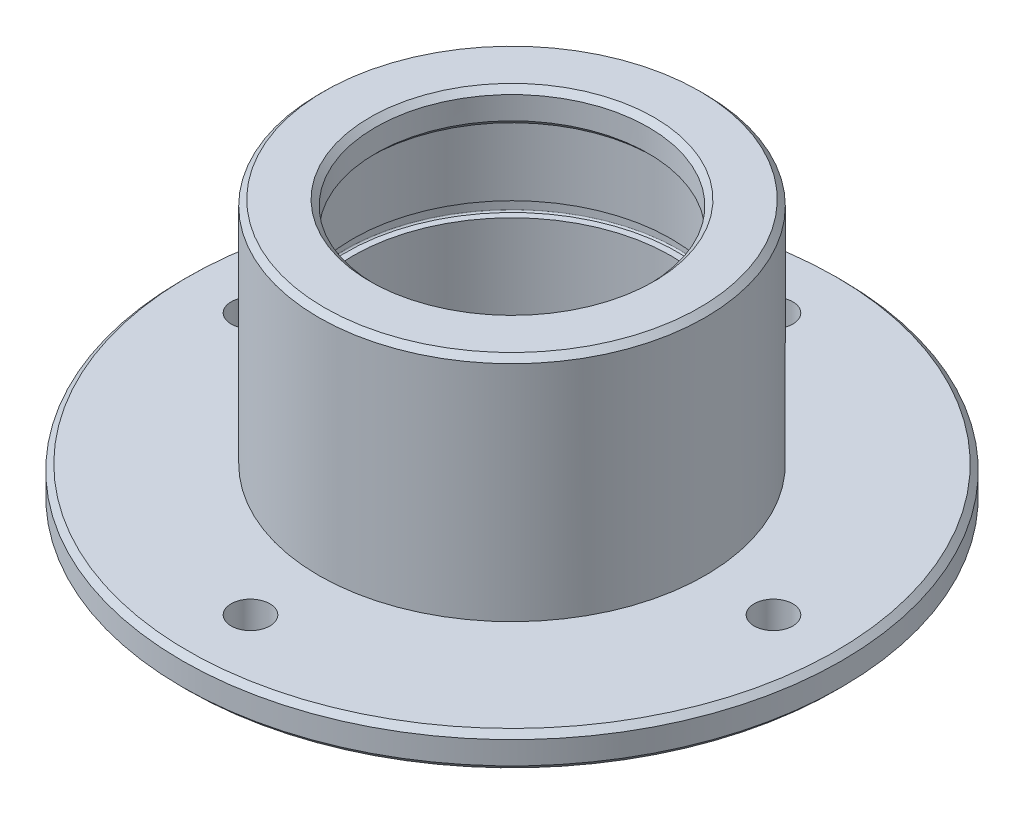
ISO-10303-21;
HEADER;
FILE_DESCRIPTION(('STEP AP214'),'2;1');
FILE_NAME('part.step','',(''),(''),'','','');
FILE_SCHEMA(('AUTOMOTIVE_DESIGN { 1 0 10303 214 1 1 1 1 }'));
ENDSEC;
DATA;
#1=APPLICATION_CONTEXT('core data for automotive mechanical design processes');
#2=APPLICATION_PROTOCOL_DEFINITION('international standard','automotive_design',2000,#1);
#3=PRODUCT_CONTEXT('',#1,'mechanical');
#4=PRODUCT('Part','Part','',(#3));
#5=PRODUCT_RELATED_PRODUCT_CATEGORY('part','',(#4));
#6=PRODUCT_DEFINITION_FORMATION('','',#4);
#7=PRODUCT_DEFINITION_CONTEXT('part definition',#1,'design');
#8=PRODUCT_DEFINITION('design','',#6,#7);
#9=PRODUCT_DEFINITION_SHAPE('','',#8);
#10=(LENGTH_UNIT() NAMED_UNIT(*) SI_UNIT(.MILLI.,.METRE.));
#11=(NAMED_UNIT(*) PLANE_ANGLE_UNIT() SI_UNIT($,.RADIAN.));
#12=(NAMED_UNIT(*) SI_UNIT($,.STERADIAN.) SOLID_ANGLE_UNIT());
#13=UNCERTAINTY_MEASURE_WITH_UNIT(LENGTH_MEASURE(1.E-05),#10,'distance_accuracy_value','');
#14=(GEOMETRIC_REPRESENTATION_CONTEXT(3) GLOBAL_UNCERTAINTY_ASSIGNED_CONTEXT((#13)) GLOBAL_UNIT_ASSIGNED_CONTEXT((#10,
#11,#12)) REPRESENTATION_CONTEXT('',''));
#15=CARTESIAN_POINT('',(0.,0.,0.));
#16=DIRECTION('',(0.,0.,1.));
#17=DIRECTION('',(1.,0.,0.));
#18=AXIS2_PLACEMENT_3D('',#15,#16,#17);
#19=CARTESIAN_POINT('',(0.,17.9540192467724,0.));
#20=DIRECTION('',(0.,1.,0.));
#21=DIRECTION('',(0.,0.,1.));
#22=AXIS2_PLACEMENT_3D('',#19,#20,#21);
#23=CYLINDRICAL_SURFACE('',#22,14.);
#24=CARTESIAN_POINT('',(0.,-2.49999999999999,0.));
#25=DIRECTION('',(0.,1.,0.));
#26=DIRECTION('',(0.,0.,1.));
#27=AXIS2_PLACEMENT_3D('',#24,#25,#26);
#28=CIRCLE('',#27,14.);
#29=CARTESIAN_POINT('',(0.,-2.49999999999999,14.));
#30=VERTEX_POINT('',#29);
#31=EDGE_CURVE('E128',#30,#30,#28,.F.);
#32=ORIENTED_EDGE('',*,*,#31,.T.);
#33=EDGE_LOOP('',(#32));
#34=FACE_BOUND('',#33,.T.);
#35=CARTESIAN_POINT('',(0.,8.85000000000001,0.));
#36=DIRECTION('',(0.,1.,0.));
#37=DIRECTION('',(0.,0.,1.));
#38=AXIS2_PLACEMENT_3D('',#35,#36,#37);
#39=CIRCLE('',#38,14.);
#40=CARTESIAN_POINT('',(0.,8.85000000000001,14.));
#41=VERTEX_POINT('',#40);
#42=EDGE_CURVE('E42',#41,#41,#39,.F.);
#43=ORIENTED_EDGE('',*,*,#42,.F.);
#44=EDGE_LOOP('',(#43));
#45=FACE_BOUND('',#44,.T.);
#46=ADVANCED_FACE('F38',(#34,#45),#23,.F.);
#47=CARTESIAN_POINT('',(0.,16.95,0.));
#48=DIRECTION('',(0.,1.,0.));
#49=DIRECTION('',(0.,0.,1.));
#50=AXIS2_PLACEMENT_3D('',#47,#48,#49);
#51=CIRCLE('',#50,14.);
#52=CARTESIAN_POINT('',(0.,16.95,14.));
#53=VERTEX_POINT('',#52);
#54=EDGE_CURVE('E112',#53,#53,#51,.T.);
#55=ORIENTED_EDGE('',*,*,#54,.T.);
#56=EDGE_LOOP('',(#55));
#57=FACE_BOUND('',#56,.T.);
#58=CARTESIAN_POINT('',(0.,10.15,0.));
#59=DIRECTION('',(0.,-1.,0.));
#60=DIRECTION('',(0.,0.,-1.));
#61=AXIS2_PLACEMENT_3D('',#58,#59,#60);
#62=CIRCLE('',#61,14.);
#63=CARTESIAN_POINT('',(0.,10.15,-14.));
#64=VERTEX_POINT('',#63);
#65=EDGE_CURVE('E56',#64,#64,#62,.F.);
#66=ORIENTED_EDGE('',*,*,#65,.F.);
#67=EDGE_LOOP('',(#66));
#68=FACE_BOUND('',#67,.T.);
#69=ADVANCED_FACE('F175',(#57,#68),#23,.F.);
#70=CARTESIAN_POINT('',(17.,0.,0.));
#71=DIRECTION('',(0.,-1.,0.));
#72=DIRECTION('',(0.,0.,-1.));
#73=AXIS2_PLACEMENT_3D('',#70,#71,#72);
#74=PLANE('',#73);
#75=CARTESIAN_POINT('',(0.,0.,0.));
#76=DIRECTION('',(0.,-1.,0.));
#77=DIRECTION('',(0.,0.,-1.));
#78=AXIS2_PLACEMENT_3D('',#75,#76,#77);
#79=CIRCLE('',#78,28.5);
#80=CARTESIAN_POINT('',(0.,0.,-28.5));
#81=VERTEX_POINT('',#80);
#82=EDGE_CURVE('E10',#81,#81,#79,.F.);
#83=ORIENTED_EDGE('',*,*,#82,.T.);
#84=EDGE_LOOP('',(#83));
#85=FACE_BOUND('',#84,.T.);
#86=CARTESIAN_POINT('',(0.,0.,-23.));
#87=DIRECTION('',(0.,1.,0.));
#88=DIRECTION('',(0.,0.,1.));
#89=AXIS2_PLACEMENT_3D('',#86,#87,#88);
#90=CIRCLE('',#89,1.7);
#91=CARTESIAN_POINT('',(0.,0.,-21.3));
#92=VERTEX_POINT('',#91);
#93=EDGE_CURVE('E65',#92,#92,#90,.T.);
#94=ORIENTED_EDGE('',*,*,#93,.F.);
#95=EDGE_LOOP('',(#94));
#96=FACE_BOUND('',#95,.T.);
#97=CARTESIAN_POINT('',(23.,0.,0.));
#98=DIRECTION('',(0.,1.,0.));
#99=DIRECTION('',(0.,0.,1.));
#100=AXIS2_PLACEMENT_3D('',#97,#98,#99);
#101=CIRCLE('',#100,1.7);
#102=CARTESIAN_POINT('',(23.,0.,1.7));
#103=VERTEX_POINT('',#102);
#104=EDGE_CURVE('E84',#103,#103,#101,.T.);
#105=ORIENTED_EDGE('',*,*,#104,.F.);
#106=EDGE_LOOP('',(#105));
#107=FACE_BOUND('',#106,.T.);
#108=CARTESIAN_POINT('',(-23.,0.,0.));
#109=DIRECTION('',(0.,1.,0.));
#110=DIRECTION('',(0.,0.,1.));
#111=AXIS2_PLACEMENT_3D('',#108,#109,#110);
#112=CIRCLE('',#111,1.7);
#113=CARTESIAN_POINT('',(-23.,0.,1.7));
#114=VERTEX_POINT('',#113);
#115=EDGE_CURVE('E100',#114,#114,#112,.T.);
#116=ORIENTED_EDGE('',*,*,#115,.F.);
#117=EDGE_LOOP('',(#116));
#118=FACE_BOUND('',#117,.T.);
#119=CARTESIAN_POINT('',(0.,0.,0.));
#120=DIRECTION('',(0.,1.,0.));
#121=DIRECTION('',(0.,0.,1.));
#122=AXIS2_PLACEMENT_3D('',#119,#120,#121);
#123=CIRCLE('',#122,17.);
#124=CARTESIAN_POINT('',(0.,0.,17.));
#125=VERTEX_POINT('',#124);
#126=EDGE_CURVE('E108',#125,#125,#123,.T.);
#127=ORIENTED_EDGE('',*,*,#126,.F.);
#128=EDGE_LOOP('',(#127));
#129=FACE_BOUND('',#128,.T.);
#130=CARTESIAN_POINT('',(0.,0.,23.));
#131=DIRECTION('',(0.,1.,0.));
#132=DIRECTION('',(0.,0.,1.));
#133=AXIS2_PLACEMENT_3D('',#130,#131,#132);
#134=CIRCLE('',#133,1.7);
#135=CARTESIAN_POINT('',(0.,0.,24.7));
#136=VERTEX_POINT('',#135);
#137=EDGE_CURVE('E92',#136,#136,#134,.T.);
#138=ORIENTED_EDGE('',*,*,#137,.F.);
#139=EDGE_LOOP('',(#138));
#140=FACE_BOUND('',#139,.T.);
#141=ADVANCED_FACE('F181',(#85,#96,#107,#118,#129,#140),#74,.F.);
#142=CARTESIAN_POINT('',(0.,17.9540192467724,0.));
#143=DIRECTION('',(0.,1.,0.));
#144=DIRECTION('',(0.,0.,1.));
#145=AXIS2_PLACEMENT_3D('',#142,#143,#144);
#146=CYLINDRICAL_SURFACE('',#145,12.);
#147=CARTESIAN_POINT('',(0.,19.65,0.));
#148=DIRECTION('',(0.,-1.,0.));
#149=DIRECTION('',(0.,0.,-1.));
#150=AXIS2_PLACEMENT_3D('',#147,#148,#149);
#151=CIRCLE('',#150,12.);
#152=CARTESIAN_POINT('',(0.,19.65,-12.));
#153=VERTEX_POINT('',#152);
#154=EDGE_CURVE('E148',#153,#153,#151,.F.);
#155=ORIENTED_EDGE('',*,*,#154,.T.);
#156=EDGE_LOOP('',(#155));
#157=FACE_BOUND('',#156,.T.);
#158=CARTESIAN_POINT('',(0.,17.65,0.));
#159=DIRECTION('',(0.,1.,0.));
#160=DIRECTION('',(0.,0.,1.));
#161=AXIS2_PLACEMENT_3D('',#158,#159,#160);
#162=CIRCLE('',#161,12.);
#163=CARTESIAN_POINT('',(0.,17.65,12.));
#164=VERTEX_POINT('',#163);
#165=EDGE_CURVE('E144',#164,#164,#162,.F.);
#166=ORIENTED_EDGE('',*,*,#165,.T.);
#167=EDGE_LOOP('',(#166));
#168=FACE_BOUND('',#167,.T.);
#169=ADVANCED_FACE('F191',(#157,#168),#146,.F.);
#170=CARTESIAN_POINT('',(12.,17.15,0.));
#171=DIRECTION('',(0.,1.,0.));
#172=DIRECTION('',(0.,0.,1.));
#173=AXIS2_PLACEMENT_3D('',#170,#171,#172);
#174=PLANE('',#173);
#175=CARTESIAN_POINT('',(0.,17.15,0.));
#176=DIRECTION('',(0.,1.,0.));
#177=DIRECTION('',(0.,0.,1.));
#178=AXIS2_PLACEMENT_3D('',#175,#176,#177);
#179=CIRCLE('',#178,12.5);
#180=CARTESIAN_POINT('',(0.,17.15,12.5));
#181=VERTEX_POINT('',#180);
#182=EDGE_CURVE('E152',#181,#181,#179,.T.);
#183=ORIENTED_EDGE('',*,*,#182,.T.);
#184=EDGE_LOOP('',(#183));
#185=FACE_BOUND('',#184,.T.);
#186=CARTESIAN_POINT('',(0.,17.15,0.));
#187=DIRECTION('',(0.,1.,0.));
#188=DIRECTION('',(0.,0.,1.));
#189=AXIS2_PLACEMENT_3D('',#186,#187,#188);
#190=CIRCLE('',#189,13.8);
#191=CARTESIAN_POINT('',(0.,17.15,13.8));
#192=VERTEX_POINT('',#191);
#193=EDGE_CURVE('E116',#192,#192,#190,.F.);
#194=ORIENTED_EDGE('',*,*,#193,.T.);
#195=EDGE_LOOP('',(#194));
#196=FACE_BOUND('',#195,.T.);
#197=ADVANCED_FACE('F188',(#185,#196),#174,.F.);
#198=CARTESIAN_POINT('',(29.,-3.,0.));
#199=DIRECTION('',(0.,1.,0.));
#200=DIRECTION('',(0.,0.,1.));
#201=AXIS2_PLACEMENT_3D('',#198,#199,#200);
#202=PLANE('',#201);
#203=CARTESIAN_POINT('',(0.,-3.,0.));
#204=DIRECTION('',(0.,1.,0.));
#205=DIRECTION('',(0.,0.,1.));
#206=AXIS2_PLACEMENT_3D('',#203,#204,#205);
#207=CIRCLE('',#206,14.5);
#208=CARTESIAN_POINT('',(0.,-3.,14.5));
#209=VERTEX_POINT('',#208);
#210=EDGE_CURVE('E124',#209,#209,#207,.T.);
#211=ORIENTED_EDGE('',*,*,#210,.T.);
#212=EDGE_LOOP('',(#211));
#213=FACE_BOUND('',#212,.T.);
#214=CARTESIAN_POINT('',(0.,-3.,0.));
#215=DIRECTION('',(0.,1.,0.));
#216=DIRECTION('',(0.,0.,1.));
#217=AXIS2_PLACEMENT_3D('',#214,#215,#216);
#218=CIRCLE('',#217,28.5);
#219=CARTESIAN_POINT('',(0.,-3.,28.5));
#220=VERTEX_POINT('',#219);
#221=EDGE_CURVE('E120',#220,#220,#218,.F.);
#222=ORIENTED_EDGE('',*,*,#221,.T.);
#223=EDGE_LOOP('',(#222));
#224=FACE_BOUND('',#223,.T.);
#225=CARTESIAN_POINT('',(0.,-3.,-23.));
#226=DIRECTION('',(0.,1.,0.));
#227=DIRECTION('',(0.,0.,1.));
#228=AXIS2_PLACEMENT_3D('',#225,#226,#227);
#229=CIRCLE('',#228,1.7);
#230=CARTESIAN_POINT('',(0.,-3.,-21.3));
#231=VERTEX_POINT('',#230);
#232=EDGE_CURVE('E80',#231,#231,#229,.T.);
#233=ORIENTED_EDGE('',*,*,#232,.T.);
#234=EDGE_LOOP('',(#233));
#235=FACE_BOUND('',#234,.T.);
#236=CARTESIAN_POINT('',(23.,-3.,0.));
#237=DIRECTION('',(0.,1.,0.));
#238=DIRECTION('',(0.,0.,1.));
#239=AXIS2_PLACEMENT_3D('',#236,#237,#238);
#240=CIRCLE('',#239,1.7);
#241=CARTESIAN_POINT('',(23.,-3.,1.7));
#242=VERTEX_POINT('',#241);
#243=EDGE_CURVE('E88',#242,#242,#240,.T.);
#244=ORIENTED_EDGE('',*,*,#243,.T.);
#245=EDGE_LOOP('',(#244));
#246=FACE_BOUND('',#245,.T.);
#247=CARTESIAN_POINT('',(0.,-3.,23.));
#248=DIRECTION('',(0.,1.,0.));
#249=DIRECTION('',(0.,0.,1.));
#250=AXIS2_PLACEMENT_3D('',#247,#248,#249);
#251=CIRCLE('',#250,1.7);
#252=CARTESIAN_POINT('',(0.,-3.,24.7));
#253=VERTEX_POINT('',#252);
#254=EDGE_CURVE('E96',#253,#253,#251,.T.);
#255=ORIENTED_EDGE('',*,*,#254,.T.);
#256=EDGE_LOOP('',(#255));
#257=FACE_BOUND('',#256,.T.);
#258=CARTESIAN_POINT('',(-23.,-3.,0.));
#259=DIRECTION('',(0.,1.,0.));
#260=DIRECTION('',(0.,0.,1.));
#261=AXIS2_PLACEMENT_3D('',#258,#259,#260);
#262=CIRCLE('',#261,1.7);
#263=CARTESIAN_POINT('',(-23.,-3.,1.7));
#264=VERTEX_POINT('',#263);
#265=EDGE_CURVE('E104',#264,#264,#262,.T.);
#266=ORIENTED_EDGE('',*,*,#265,.T.);
#267=EDGE_LOOP('',(#266));
#268=FACE_BOUND('',#267,.T.);
#269=ADVANCED_FACE('F186',(#213,#224,#235,#246,#257,#268),#202,.F.);
#270=CARTESIAN_POINT('',(0.,17.9540192467724,0.));
#271=DIRECTION('',(0.,1.,0.));
#272=DIRECTION('',(0.,0.,1.));
#273=AXIS2_PLACEMENT_3D('',#270,#271,#272);
#274=CYLINDRICAL_SURFACE('',#273,29.);
#275=CARTESIAN_POINT('',(0.,-2.5,0.));
#276=DIRECTION('',(0.,1.,0.));
#277=DIRECTION('',(0.,0.,1.));
#278=AXIS2_PLACEMENT_3D('',#275,#276,#277);
#279=CIRCLE('',#278,29.);
#280=CARTESIAN_POINT('',(0.,-2.5,29.));
#281=VERTEX_POINT('',#280);
#282=EDGE_CURVE('E47',#281,#281,#279,.T.);
#283=ORIENTED_EDGE('',*,*,#282,.T.);
#284=EDGE_LOOP('',(#283));
#285=FACE_BOUND('',#284,.T.);
#286=CARTESIAN_POINT('',(0.,-0.500000000000014,0.));
#287=DIRECTION('',(0.,-1.,0.));
#288=DIRECTION('',(0.,0.,-1.));
#289=AXIS2_PLACEMENT_3D('',#286,#287,#288);
#290=CIRCLE('',#289,29.);
#291=CARTESIAN_POINT('',(0.,-0.500000000000014,-29.));
#292=VERTEX_POINT('',#291);
#293=EDGE_CURVE('E53',#292,#292,#290,.T.);
#294=ORIENTED_EDGE('',*,*,#293,.T.);
#295=EDGE_LOOP('',(#294));
#296=FACE_BOUND('',#295,.T.);
#297=ADVANCED_FACE('F159',(#285,#296),#274,.T.);
#298=CARTESIAN_POINT('',(0.,17.9540192467724,0.));
#299=DIRECTION('',(0.,1.,0.));
#300=DIRECTION('',(0.,0.,1.));
#301=AXIS2_PLACEMENT_3D('',#298,#299,#300);
#302=CYLINDRICAL_SURFACE('',#301,17.);
#303=CARTESIAN_POINT('',(0.,19.65,0.));
#304=DIRECTION('',(0.,-1.,0.));
#305=DIRECTION('',(0.,0.,-1.));
#306=AXIS2_PLACEMENT_3D('',#303,#304,#305);
#307=CIRCLE('',#306,17.);
#308=CARTESIAN_POINT('',(0.,19.65,-17.));
#309=VERTEX_POINT('',#308);
#310=EDGE_CURVE('E140',#309,#309,#307,.T.);
#311=ORIENTED_EDGE('',*,*,#310,.T.);
#312=EDGE_LOOP('',(#311));
#313=FACE_BOUND('',#312,.T.);
#314=ORIENTED_EDGE('',*,*,#126,.T.);
#315=EDGE_LOOP('',(#314));
#316=FACE_BOUND('',#315,.T.);
#317=ADVANCED_FACE('F315',(#313,#316),#302,.T.);
#318=CARTESIAN_POINT('',(17.,20.15,0.));
#319=DIRECTION('',(0.,-1.,0.));
#320=DIRECTION('',(0.,0.,-1.));
#321=AXIS2_PLACEMENT_3D('',#318,#319,#320);
#322=PLANE('',#321);
#323=CARTESIAN_POINT('',(0.,20.15,0.));
#324=DIRECTION('',(0.,-1.,0.));
#325=DIRECTION('',(0.,0.,-1.));
#326=AXIS2_PLACEMENT_3D('',#323,#324,#325);
#327=CIRCLE('',#326,16.5);
#328=CARTESIAN_POINT('',(0.,20.15,-16.5));
#329=VERTEX_POINT('',#328);
#330=EDGE_CURVE('E136',#329,#329,#327,.F.);
#331=ORIENTED_EDGE('',*,*,#330,.T.);
#332=EDGE_LOOP('',(#331));
#333=FACE_BOUND('',#332,.T.);
#334=CARTESIAN_POINT('',(0.,20.15,0.));
#335=DIRECTION('',(0.,-1.,0.));
#336=DIRECTION('',(0.,0.,-1.));
#337=AXIS2_PLACEMENT_3D('',#334,#335,#336);
#338=CIRCLE('',#337,12.5);
#339=CARTESIAN_POINT('',(0.,20.15,-12.5));
#340=VERTEX_POINT('',#339);
#341=EDGE_CURVE('E132',#340,#340,#338,.T.);
#342=ORIENTED_EDGE('',*,*,#341,.T.);
#343=EDGE_LOOP('',(#342));
#344=FACE_BOUND('',#343,.T.);
#345=ADVANCED_FACE('F311',(#333,#344),#322,.F.);
#346=CARTESIAN_POINT('',(-23.,0.,0.));
#347=DIRECTION('',(0.,1.,0.));
#348=DIRECTION('',(0.,0.,1.));
#349=AXIS2_PLACEMENT_3D('',#346,#347,#348);
#350=CYLINDRICAL_SURFACE('',#349,1.7);
#351=ORIENTED_EDGE('',*,*,#265,.F.);
#352=EDGE_LOOP('',(#351));
#353=FACE_BOUND('',#352,.T.);
#354=ORIENTED_EDGE('',*,*,#115,.T.);
#355=EDGE_LOOP('',(#354));
#356=FACE_BOUND('',#355,.T.);
#357=ADVANCED_FACE('F307',(#353,#356),#350,.F.);
#358=CARTESIAN_POINT('',(0.,0.,23.));
#359=DIRECTION('',(0.,1.,0.));
#360=DIRECTION('',(0.,0.,1.));
#361=AXIS2_PLACEMENT_3D('',#358,#359,#360);
#362=CYLINDRICAL_SURFACE('',#361,1.7);
#363=ORIENTED_EDGE('',*,*,#254,.F.);
#364=EDGE_LOOP('',(#363));
#365=FACE_BOUND('',#364,.T.);
#366=ORIENTED_EDGE('',*,*,#137,.T.);
#367=EDGE_LOOP('',(#366));
#368=FACE_BOUND('',#367,.T.);
#369=ADVANCED_FACE('F303',(#365,#368),#362,.F.);
#370=CARTESIAN_POINT('',(23.,0.,0.));
#371=DIRECTION('',(0.,1.,0.));
#372=DIRECTION('',(0.,0.,1.));
#373=AXIS2_PLACEMENT_3D('',#370,#371,#372);
#374=CYLINDRICAL_SURFACE('',#373,1.7);
#375=ORIENTED_EDGE('',*,*,#243,.F.);
#376=EDGE_LOOP('',(#375));
#377=FACE_BOUND('',#376,.T.);
#378=ORIENTED_EDGE('',*,*,#104,.T.);
#379=EDGE_LOOP('',(#378));
#380=FACE_BOUND('',#379,.T.);
#381=ADVANCED_FACE('F299',(#377,#380),#374,.F.);
#382=CARTESIAN_POINT('',(0.,0.,-23.));
#383=DIRECTION('',(0.,1.,0.));
#384=DIRECTION('',(0.,0.,1.));
#385=AXIS2_PLACEMENT_3D('',#382,#383,#384);
#386=CYLINDRICAL_SURFACE('',#385,1.7);
#387=ORIENTED_EDGE('',*,*,#232,.F.);
#388=EDGE_LOOP('',(#387));
#389=FACE_BOUND('',#388,.T.);
#390=ORIENTED_EDGE('',*,*,#93,.T.);
#391=EDGE_LOOP('',(#390));
#392=FACE_BOUND('',#391,.T.);
#393=ADVANCED_FACE('F200',(#389,#392),#386,.F.);
#394=CARTESIAN_POINT('',(0.,16.95,0.));
#395=DIRECTION('',(0.,1.,0.));
#396=DIRECTION('',(0.,0.,1.));
#397=AXIS2_PLACEMENT_3D('',#394,#395,#396);
#398=TOROIDAL_SURFACE('',#397,13.8,0.2);
#399=ORIENTED_EDGE('',*,*,#193,.F.);
#400=EDGE_LOOP('',(#399));
#401=FACE_BOUND('',#400,.T.);
#402=ORIENTED_EDGE('',*,*,#54,.F.);
#403=EDGE_LOOP('',(#402));
#404=FACE_BOUND('',#403,.T.);
#405=ADVANCED_FACE('F196',(#401,#404),#398,.F.);
#406=CARTESIAN_POINT('',(0.,-3.,0.));
#407=DIRECTION('',(0.,-1.,0.));
#408=DIRECTION('',(0.,0.,-1.));
#409=AXIS2_PLACEMENT_3D('',#406,#407,#408);
#410=CONICAL_SURFACE('',#409,14.5,0.785398163397447);
#411=ORIENTED_EDGE('',*,*,#31,.F.);
#412=EDGE_LOOP('',(#411));
#413=FACE_BOUND('',#412,.T.);
#414=ORIENTED_EDGE('',*,*,#210,.F.);
#415=EDGE_LOOP('',(#414));
#416=FACE_BOUND('',#415,.T.);
#417=ADVANCED_FACE('F199',(#413,#416),#410,.F.);
#418=CARTESIAN_POINT('',(0.,20.15,0.));
#419=DIRECTION('',(0.,-1.,0.));
#420=DIRECTION('',(0.,0.,-1.));
#421=AXIS2_PLACEMENT_3D('',#418,#419,#420);
#422=CONICAL_SURFACE('',#421,16.5,0.785398163397448);
#423=ORIENTED_EDGE('',*,*,#310,.F.);
#424=EDGE_LOOP('',(#423));
#425=FACE_BOUND('',#424,.T.);
#426=ORIENTED_EDGE('',*,*,#330,.F.);
#427=EDGE_LOOP('',(#426));
#428=FACE_BOUND('',#427,.T.);
#429=ADVANCED_FACE('F204',(#425,#428),#422,.T.);
#430=CARTESIAN_POINT('',(0.,19.65,0.));
#431=DIRECTION('',(0.,1.,0.));
#432=DIRECTION('',(0.,0.,1.));
#433=AXIS2_PLACEMENT_3D('',#430,#431,#432);
#434=CONICAL_SURFACE('',#433,12.,0.785398163397447);
#435=ORIENTED_EDGE('',*,*,#341,.F.);
#436=EDGE_LOOP('',(#435));
#437=FACE_BOUND('',#436,.T.);
#438=ORIENTED_EDGE('',*,*,#154,.F.);
#439=EDGE_LOOP('',(#438));
#440=FACE_BOUND('',#439,.T.);
#441=ADVANCED_FACE('F208',(#437,#440),#434,.F.);
#442=CARTESIAN_POINT('',(0.,17.15,0.));
#443=DIRECTION('',(0.,-1.,0.));
#444=DIRECTION('',(0.,0.,-1.));
#445=AXIS2_PLACEMENT_3D('',#442,#443,#444);
#446=CONICAL_SURFACE('',#445,12.5,0.785398163397447);
#447=ORIENTED_EDGE('',*,*,#165,.F.);
#448=EDGE_LOOP('',(#447));
#449=FACE_BOUND('',#448,.T.);
#450=ORIENTED_EDGE('',*,*,#182,.F.);
#451=EDGE_LOOP('',(#450));
#452=FACE_BOUND('',#451,.T.);
#453=ADVANCED_FACE('F172',(#449,#452),#446,.F.);
#454=CARTESIAN_POINT('',(0.,-2.5,0.));
#455=DIRECTION('',(0.,1.,0.));
#456=DIRECTION('',(0.,0.,1.));
#457=AXIS2_PLACEMENT_3D('',#454,#455,#456);
#458=CONICAL_SURFACE('',#457,29.,0.785398163397448);
#459=ORIENTED_EDGE('',*,*,#221,.F.);
#460=EDGE_LOOP('',(#459));
#461=FACE_BOUND('',#460,.T.);
#462=ORIENTED_EDGE('',*,*,#282,.F.);
#463=EDGE_LOOP('',(#462));
#464=FACE_BOUND('',#463,.T.);
#465=ADVANCED_FACE('F164',(#461,#464),#458,.T.);
#466=CARTESIAN_POINT('',(0.,0.,0.));
#467=DIRECTION('',(0.,-1.,0.));
#468=DIRECTION('',(0.,0.,-1.));
#469=AXIS2_PLACEMENT_3D('',#466,#467,#468);
#470=CONICAL_SURFACE('',#469,28.5,0.785398163397435);
#471=ORIENTED_EDGE('',*,*,#293,.F.);
#472=EDGE_LOOP('',(#471));
#473=FACE_BOUND('',#472,.T.);
#474=ORIENTED_EDGE('',*,*,#82,.F.);
#475=EDGE_LOOP('',(#474));
#476=FACE_BOUND('',#475,.T.);
#477=ADVANCED_FACE('F40',(#473,#476),#470,.T.);
#478=CARTESIAN_POINT('',(0.,8.85000000000001,14.57));
#479=DIRECTION('',(0.,1.,0.));
#480=DIRECTION('',(0.,0.,1.));
#481=AXIS2_PLACEMENT_3D('',#478,#479,#480);
#482=PLANE('',#481);
#483=CARTESIAN_POINT('',(0.,8.85000000000001,0.));
#484=DIRECTION('',(0.,1.,0.));
#485=DIRECTION('',(0.,0.,1.));
#486=AXIS2_PLACEMENT_3D('',#483,#484,#485);
#487=CIRCLE('',#486,14.57);
#488=CARTESIAN_POINT('',(0.,8.85000000000001,14.57));
#489=VERTEX_POINT('',#488);
#490=EDGE_CURVE('E59',#489,#489,#487,.T.);
#491=ORIENTED_EDGE('',*,*,#490,.T.);
#492=EDGE_LOOP('',(#491));
#493=FACE_BOUND('',#492,.T.);
#494=ORIENTED_EDGE('',*,*,#42,.T.);
#495=EDGE_LOOP('',(#494));
#496=FACE_BOUND('',#495,.T.);
#497=ADVANCED_FACE('F163',(#493,#496),#482,.T.);
#498=CARTESIAN_POINT('',(0.,10.15,12.6));
#499=DIRECTION('',(0.,-1.,0.));
#500=DIRECTION('',(0.,0.,-1.));
#501=AXIS2_PLACEMENT_3D('',#498,#499,#500);
#502=PLANE('',#501);
#503=CARTESIAN_POINT('',(0.,10.15,0.));
#504=DIRECTION('',(0.,1.,0.));
#505=DIRECTION('',(0.,0.,1.));
#506=AXIS2_PLACEMENT_3D('',#503,#504,#505);
#507=CIRCLE('',#506,14.57);
#508=CARTESIAN_POINT('',(0.,10.15,14.57));
#509=VERTEX_POINT('',#508);
#510=EDGE_CURVE('E452',#509,#509,#507,.T.);
#511=ORIENTED_EDGE('',*,*,#510,.F.);
#512=EDGE_LOOP('',(#511));
#513=FACE_BOUND('',#512,.T.);
#514=ORIENTED_EDGE('',*,*,#65,.T.);
#515=EDGE_LOOP('',(#514));
#516=FACE_BOUND('',#515,.T.);
#517=ADVANCED_FACE('F170',(#513,#516),#502,.T.);
#518=CARTESIAN_POINT('',(0.,8.98000000000001,0.));
#519=DIRECTION('',(0.,1.,0.));
#520=DIRECTION('',(0.,0.,1.));
#521=AXIS2_PLACEMENT_3D('',#518,#519,#520);
#522=TOROIDAL_SURFACE('',#521,14.57,0.13);
#523=CARTESIAN_POINT('',(0.,8.98000000000001,0.));
#524=DIRECTION('',(0.,1.,0.));
#525=DIRECTION('',(0.,0.,1.));
#526=AXIS2_PLACEMENT_3D('',#523,#524,#525);
#527=CIRCLE('',#526,14.7);
#528=CARTESIAN_POINT('',(0.,8.98000000000001,14.7));
#529=VERTEX_POINT('',#528);
#530=EDGE_CURVE('E67',#529,#529,#527,.T.);
#531=ORIENTED_EDGE('',*,*,#530,.T.);
#532=EDGE_LOOP('',(#531));
#533=FACE_BOUND('',#532,.T.);
#534=ORIENTED_EDGE('',*,*,#490,.F.);
#535=EDGE_LOOP('',(#534));
#536=FACE_BOUND('',#535,.T.);
#537=ADVANCED_FACE('F260',(#533,#536),#522,.F.);
#538=CARTESIAN_POINT('',(0.,-32.0459807532276,0.));
#539=DIRECTION('',(0.,1.,0.));
#540=DIRECTION('',(0.,0.,1.));
#541=AXIS2_PLACEMENT_3D('',#538,#539,#540);
#542=CYLINDRICAL_SURFACE('',#541,14.7);
#543=CARTESIAN_POINT('',(0.,10.02,0.));
#544=DIRECTION('',(0.,1.,0.));
#545=DIRECTION('',(0.,0.,1.));
#546=AXIS2_PLACEMENT_3D('',#543,#544,#545);
#547=CIRCLE('',#546,14.7);
#548=CARTESIAN_POINT('',(0.,10.02,14.7));
#549=VERTEX_POINT('',#548);
#550=EDGE_CURVE('E73',#549,#549,#547,.T.);
#551=ORIENTED_EDGE('',*,*,#550,.T.);
#552=EDGE_LOOP('',(#551));
#553=FACE_BOUND('',#552,.T.);
#554=ORIENTED_EDGE('',*,*,#530,.F.);
#555=EDGE_LOOP('',(#554));
#556=FACE_BOUND('',#555,.T.);
#557=ADVANCED_FACE('F269',(#553,#556),#542,.F.);
#558=CARTESIAN_POINT('',(0.,10.02,0.));
#559=DIRECTION('',(0.,1.,0.));
#560=DIRECTION('',(0.,0.,1.));
#561=AXIS2_PLACEMENT_3D('',#558,#559,#560);
#562=TOROIDAL_SURFACE('',#561,14.57,0.13);
#563=ORIENTED_EDGE('',*,*,#510,.T.);
#564=EDGE_LOOP('',(#563));
#565=FACE_BOUND('',#564,.T.);
#566=ORIENTED_EDGE('',*,*,#550,.F.);
#567=EDGE_LOOP('',(#566));
#568=FACE_BOUND('',#567,.T.);
#569=ADVANCED_FACE('F278',(#565,#568),#562,.F.);
#570=CLOSED_SHELL('',(#46,#69,#141,#169,#197,#269,#297,#317,#345,#357,#369,#381,#393,#405,#417,
#429,#441,#453,#465,#477,#497,#517,#537,#557,#569));
#571=MANIFOLD_SOLID_BREP('B2',#570);
#572=ADVANCED_BREP_SHAPE_REPRESENTATION('',(#18,#571),#14);
#573=SHAPE_DEFINITION_REPRESENTATION(#9,#572);
ENDSEC;
END-ISO-10303-21;
